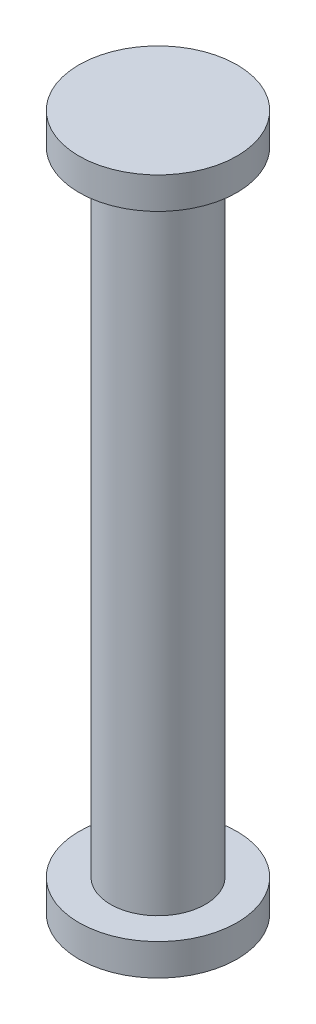
ISO-10303-21;
HEADER;
FILE_DESCRIPTION(('STEP AP214'),'2;1');
FILE_NAME('part.step','',(''),(''),'','','');
FILE_SCHEMA(('AUTOMOTIVE_DESIGN { 1 0 10303 214 1 1 1 1 }'));
ENDSEC;
DATA;
#1=APPLICATION_CONTEXT('core data for automotive mechanical design processes');
#2=APPLICATION_PROTOCOL_DEFINITION('international standard','automotive_design',2000,#1);
#3=PRODUCT_CONTEXT('',#1,'mechanical');
#4=PRODUCT('Part','Part','',(#3));
#5=PRODUCT_RELATED_PRODUCT_CATEGORY('part','',(#4));
#6=PRODUCT_DEFINITION_FORMATION('','',#4);
#7=PRODUCT_DEFINITION_CONTEXT('part definition',#1,'design');
#8=PRODUCT_DEFINITION('design','',#6,#7);
#9=PRODUCT_DEFINITION_SHAPE('','',#8);
#10=(LENGTH_UNIT() NAMED_UNIT(*) SI_UNIT(.MILLI.,.METRE.));
#11=(NAMED_UNIT(*) PLANE_ANGLE_UNIT() SI_UNIT($,.RADIAN.));
#12=(NAMED_UNIT(*) SI_UNIT($,.STERADIAN.) SOLID_ANGLE_UNIT());
#13=UNCERTAINTY_MEASURE_WITH_UNIT(LENGTH_MEASURE(1.E-05),#10,'distance_accuracy_value','');
#14=(GEOMETRIC_REPRESENTATION_CONTEXT(3) GLOBAL_UNCERTAINTY_ASSIGNED_CONTEXT((#13)) GLOBAL_UNIT_ASSIGNED_CONTEXT((#10,
#11,#12)) REPRESENTATION_CONTEXT('',''));
#15=CARTESIAN_POINT('',(0.,0.,0.));
#16=DIRECTION('',(0.,0.,1.));
#17=DIRECTION('',(1.,0.,0.));
#18=AXIS2_PLACEMENT_3D('',#15,#16,#17);
#19=CARTESIAN_POINT('',(0.,75.,0.));
#20=DIRECTION('',(0.,-1.,0.));
#21=DIRECTION('',(0.,0.,-1.));
#22=AXIS2_PLACEMENT_3D('',#19,#20,#21);
#23=CYLINDRICAL_SURFACE('',#22,3.75);
#24=CARTESIAN_POINT('',(0.,75.,0.));
#25=DIRECTION('',(0.,1.,0.));
#26=DIRECTION('',(0.,0.,1.));
#27=AXIS2_PLACEMENT_3D('',#24,#25,#26);
#28=CIRCLE('',#27,3.75);
#29=CARTESIAN_POINT('',(0.,75.,3.75));
#30=VERTEX_POINT('',#29);
#31=EDGE_CURVE('E10',#30,#30,#28,.T.);
#32=ORIENTED_EDGE('',*,*,#31,.F.);
#33=EDGE_LOOP('',(#32));
#34=FACE_BOUND('',#33,.T.);
#35=CARTESIAN_POINT('',(0.,25.,0.));
#36=DIRECTION('',(0.,1.,0.));
#37=DIRECTION('',(0.,0.,1.));
#38=AXIS2_PLACEMENT_3D('',#35,#36,#37);
#39=CIRCLE('',#38,3.75);
#40=CARTESIAN_POINT('',(0.,25.,3.75));
#41=VERTEX_POINT('',#40);
#42=EDGE_CURVE('E41',#41,#41,#39,.T.);
#43=ORIENTED_EDGE('',*,*,#42,.T.);
#44=EDGE_LOOP('',(#43));
#45=FACE_BOUND('',#44,.T.);
#46=ADVANCED_FACE('F38',(#34,#45),#23,.T.);
#47=CARTESIAN_POINT('',(0.,77.5,0.));
#48=DIRECTION('',(0.,-1.,0.));
#49=DIRECTION('',(0.,0.,-1.));
#50=AXIS2_PLACEMENT_3D('',#47,#48,#49);
#51=CYLINDRICAL_SURFACE('',#50,6.25);
#52=CARTESIAN_POINT('',(0.,77.5,0.));
#53=DIRECTION('',(0.,1.,0.));
#54=DIRECTION('',(0.,0.,1.));
#55=AXIS2_PLACEMENT_3D('',#52,#53,#54);
#56=CIRCLE('',#55,6.25);
#57=CARTESIAN_POINT('',(0.,77.5,6.25));
#58=VERTEX_POINT('',#57);
#59=EDGE_CURVE('E45',#58,#58,#56,.T.);
#60=ORIENTED_EDGE('',*,*,#59,.F.);
#61=EDGE_LOOP('',(#60));
#62=FACE_BOUND('',#61,.T.);
#63=CARTESIAN_POINT('',(0.,75.,0.));
#64=DIRECTION('',(0.,1.,0.));
#65=DIRECTION('',(0.,0.,1.));
#66=AXIS2_PLACEMENT_3D('',#63,#64,#65);
#67=CIRCLE('',#66,6.25);
#68=CARTESIAN_POINT('',(0.,75.,6.25));
#69=VERTEX_POINT('',#68);
#70=EDGE_CURVE('E49',#69,#69,#67,.T.);
#71=ORIENTED_EDGE('',*,*,#70,.T.);
#72=EDGE_LOOP('',(#71));
#73=FACE_BOUND('',#72,.T.);
#74=ADVANCED_FACE('F86',(#62,#73),#51,.T.);
#75=CARTESIAN_POINT('',(0.,77.5,0.));
#76=DIRECTION('',(0.,1.,0.));
#77=DIRECTION('',(0.,0.,1.));
#78=AXIS2_PLACEMENT_3D('',#75,#76,#77);
#79=PLANE('',#78);
#80=ORIENTED_EDGE('',*,*,#59,.T.);
#81=EDGE_LOOP('',(#80));
#82=FACE_BOUND('',#81,.T.);
#83=ADVANCED_FACE('F82',(#82),#79,.T.);
#84=CARTESIAN_POINT('',(0.,75.,0.));
#85=DIRECTION('',(0.,1.,0.));
#86=DIRECTION('',(0.,0.,1.));
#87=AXIS2_PLACEMENT_3D('',#84,#85,#86);
#88=PLANE('',#87);
#89=ORIENTED_EDGE('',*,*,#31,.T.);
#90=EDGE_LOOP('',(#89));
#91=FACE_BOUND('',#90,.T.);
#92=ORIENTED_EDGE('',*,*,#70,.F.);
#93=EDGE_LOOP('',(#92));
#94=FACE_BOUND('',#93,.T.);
#95=ADVANCED_FACE('F74',(#91,#94),#88,.F.);
#96=CARTESIAN_POINT('',(0.,22.5,0.));
#97=DIRECTION('',(0.,1.,0.));
#98=DIRECTION('',(0.,0.,1.));
#99=AXIS2_PLACEMENT_3D('',#96,#97,#98);
#100=CYLINDRICAL_SURFACE('',#99,6.25);
#101=CARTESIAN_POINT('',(0.,22.5,0.));
#102=DIRECTION('',(0.,-1.,0.));
#103=DIRECTION('',(0.,0.,-1.));
#104=AXIS2_PLACEMENT_3D('',#101,#102,#103);
#105=CIRCLE('',#104,6.25);
#106=CARTESIAN_POINT('',(0.,22.5,-6.25));
#107=VERTEX_POINT('',#106);
#108=EDGE_CURVE('E57',#107,#107,#105,.T.);
#109=ORIENTED_EDGE('',*,*,#108,.F.);
#110=EDGE_LOOP('',(#109));
#111=FACE_BOUND('',#110,.T.);
#112=CARTESIAN_POINT('',(0.,25.,0.));
#113=DIRECTION('',(0.,-1.,0.));
#114=DIRECTION('',(0.,0.,-1.));
#115=AXIS2_PLACEMENT_3D('',#112,#113,#114);
#116=CIRCLE('',#115,6.25);
#117=CARTESIAN_POINT('',(0.,25.,-6.25));
#118=VERTEX_POINT('',#117);
#119=EDGE_CURVE('E54',#118,#118,#116,.T.);
#120=ORIENTED_EDGE('',*,*,#119,.T.);
#121=EDGE_LOOP('',(#120));
#122=FACE_BOUND('',#121,.T.);
#123=ADVANCED_FACE('F72',(#111,#122),#100,.T.);
#124=CARTESIAN_POINT('',(0.,22.5,0.));
#125=DIRECTION('',(0.,-1.,0.));
#126=DIRECTION('',(0.,0.,-1.));
#127=AXIS2_PLACEMENT_3D('',#124,#125,#126);
#128=PLANE('',#127);
#129=ORIENTED_EDGE('',*,*,#108,.T.);
#130=EDGE_LOOP('',(#129));
#131=FACE_BOUND('',#130,.T.);
#132=ADVANCED_FACE('F68',(#131),#128,.T.);
#133=CARTESIAN_POINT('',(0.,25.,0.));
#134=DIRECTION('',(0.,-1.,0.));
#135=DIRECTION('',(0.,0.,-1.));
#136=AXIS2_PLACEMENT_3D('',#133,#134,#135);
#137=PLANE('',#136);
#138=ORIENTED_EDGE('',*,*,#42,.F.);
#139=EDGE_LOOP('',(#138));
#140=FACE_BOUND('',#139,.T.);
#141=ORIENTED_EDGE('',*,*,#119,.F.);
#142=EDGE_LOOP('',(#141));
#143=FACE_BOUND('',#142,.T.);
#144=ADVANCED_FACE('F65',(#140,#143),#137,.F.);
#145=CLOSED_SHELL('',(#46,#74,#83,#95,#123,#132,#144));
#146=MANIFOLD_SOLID_BREP('B2',#145);
#147=ADVANCED_BREP_SHAPE_REPRESENTATION('',(#18,#146),#14);
#148=SHAPE_DEFINITION_REPRESENTATION(#9,#147);
ENDSEC;
END-ISO-10303-21;
